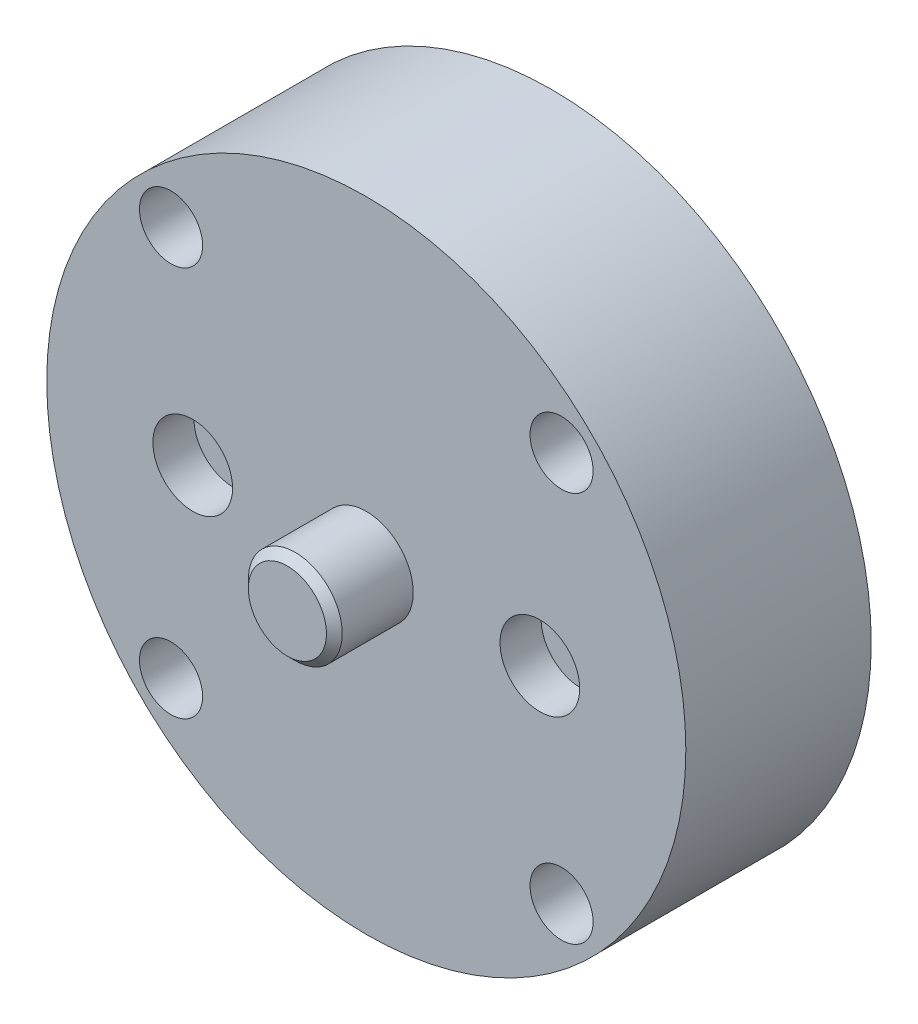
ISO-10303-21;
HEADER;
FILE_DESCRIPTION(('STEP AP214'),'2;1');
FILE_NAME('part.step','',(''),(''),'','','');
FILE_SCHEMA(('AUTOMOTIVE_DESIGN { 1 0 10303 214 1 1 1 1 }'));
ENDSEC;
DATA;
#1=APPLICATION_CONTEXT('core data for automotive mechanical design processes');
#2=APPLICATION_PROTOCOL_DEFINITION('international standard','automotive_design',2000,#1);
#3=PRODUCT_CONTEXT('',#1,'mechanical');
#4=PRODUCT('Part','Part','',(#3));
#5=PRODUCT_RELATED_PRODUCT_CATEGORY('part','',(#4));
#6=PRODUCT_DEFINITION_FORMATION('','',#4);
#7=PRODUCT_DEFINITION_CONTEXT('part definition',#1,'design');
#8=PRODUCT_DEFINITION('design','',#6,#7);
#9=PRODUCT_DEFINITION_SHAPE('','',#8);
#10=(LENGTH_UNIT() NAMED_UNIT(*) SI_UNIT(.MILLI.,.METRE.));
#11=(NAMED_UNIT(*) PLANE_ANGLE_UNIT() SI_UNIT($,.RADIAN.));
#12=(NAMED_UNIT(*) SI_UNIT($,.STERADIAN.) SOLID_ANGLE_UNIT());
#13=UNCERTAINTY_MEASURE_WITH_UNIT(LENGTH_MEASURE(1.E-05),#10,'distance_accuracy_value','');
#14=(GEOMETRIC_REPRESENTATION_CONTEXT(3) GLOBAL_UNCERTAINTY_ASSIGNED_CONTEXT((#13)) GLOBAL_UNIT_ASSIGNED_CONTEXT((#10,
#11,#12)) REPRESENTATION_CONTEXT('',''));
#15=CARTESIAN_POINT('',(0.,0.,0.));
#16=DIRECTION('',(0.,0.,1.));
#17=DIRECTION('',(1.,0.,0.));
#18=AXIS2_PLACEMENT_3D('',#15,#16,#17);
#19=CARTESIAN_POINT('',(0.,0.,23.5));
#20=DIRECTION('',(0.,0.,-1.));
#21=DIRECTION('',(-1.,0.,0.));
#22=AXIS2_PLACEMENT_3D('',#19,#20,#21);
#23=CYLINDRICAL_SURFACE('',#22,40.5);
#24=CARTESIAN_POINT('',(0.,0.,23.5));
#25=DIRECTION('',(0.,0.,-1.));
#26=DIRECTION('',(-1.,0.,0.));
#27=AXIS2_PLACEMENT_3D('',#24,#25,#26);
#28=CIRCLE('',#27,40.5);
#29=CARTESIAN_POINT('',(-40.5,0.,23.5));
#30=VERTEX_POINT('',#29);
#31=EDGE_CURVE('E60',#30,#30,#28,.T.);
#32=ORIENTED_EDGE('',*,*,#31,.T.);
#33=EDGE_LOOP('',(#32));
#34=FACE_BOUND('',#33,.T.);
#35=CARTESIAN_POINT('',(0.,0.,0.));
#36=DIRECTION('',(0.,0.,-1.));
#37=DIRECTION('',(-1.,0.,0.));
#38=AXIS2_PLACEMENT_3D('',#35,#36,#37);
#39=CIRCLE('',#38,40.5);
#40=CARTESIAN_POINT('',(-40.5,0.,0.));
#41=VERTEX_POINT('',#40);
#42=EDGE_CURVE('E62',#41,#41,#39,.T.);
#43=ORIENTED_EDGE('',*,*,#42,.F.);
#44=EDGE_LOOP('',(#43));
#45=FACE_BOUND('',#44,.T.);
#46=ADVANCED_FACE('F41',(#34,#45),#23,.T.);
#47=CARTESIAN_POINT('',(40.5,0.,23.5));
#48=DIRECTION('',(0.,0.,1.));
#49=DIRECTION('',(1.,0.,0.));
#50=AXIS2_PLACEMENT_3D('',#47,#48,#49);
#51=PLANE('',#50);
#52=CARTESIAN_POINT('',(24.748737341529,24.748737341529,23.5));
#53=DIRECTION('',(0.,0.,1.));
#54=DIRECTION('',(1.,0.,0.));
#55=AXIS2_PLACEMENT_3D('',#52,#53,#54);
#56=CIRCLE('',#55,3.99999999999999);
#57=CARTESIAN_POINT('',(28.748737341529,24.748737341529,23.5));
#58=VERTEX_POINT('',#57);
#59=EDGE_CURVE('E125',#58,#58,#56,.T.);
#60=ORIENTED_EDGE('',*,*,#59,.F.);
#61=EDGE_LOOP('',(#60));
#62=FACE_BOUND('',#61,.T.);
#63=CARTESIAN_POINT('',(-24.74873734152,24.748737341529,23.5));
#64=DIRECTION('',(0.,0.,1.));
#65=DIRECTION('',(1.,0.,0.));
#66=AXIS2_PLACEMENT_3D('',#63,#64,#65);
#67=CIRCLE('',#66,3.99999999999999);
#68=CARTESIAN_POINT('',(-20.74873734152,24.748737341529,23.5));
#69=VERTEX_POINT('',#68);
#70=EDGE_CURVE('E109',#69,#69,#67,.T.);
#71=ORIENTED_EDGE('',*,*,#70,.F.);
#72=EDGE_LOOP('',(#71));
#73=FACE_BOUND('',#72,.T.);
#74=CARTESIAN_POINT('',(24.748737341529,-24.74873734152,23.5));
#75=DIRECTION('',(0.,0.,1.));
#76=DIRECTION('',(1.,0.,0.));
#77=AXIS2_PLACEMENT_3D('',#74,#75,#76);
#78=CIRCLE('',#77,3.99999999999999);
#79=CARTESIAN_POINT('',(28.748737341529,-24.74873734152,23.5));
#80=VERTEX_POINT('',#79);
#81=EDGE_CURVE('E96',#80,#80,#78,.T.);
#82=ORIENTED_EDGE('',*,*,#81,.F.);
#83=EDGE_LOOP('',(#82));
#84=FACE_BOUND('',#83,.T.);
#85=CARTESIAN_POINT('',(-24.74873734152,-24.74873734152,23.5));
#86=DIRECTION('',(0.,0.,1.));
#87=DIRECTION('',(1.,0.,0.));
#88=AXIS2_PLACEMENT_3D('',#85,#86,#87);
#89=CIRCLE('',#88,3.99999999999999);
#90=CARTESIAN_POINT('',(-20.74873734152,-24.74873734152,23.5));
#91=VERTEX_POINT('',#90);
#92=EDGE_CURVE('E87',#91,#91,#89,.T.);
#93=ORIENTED_EDGE('',*,*,#92,.F.);
#94=EDGE_LOOP('',(#93));
#95=FACE_BOUND('',#94,.T.);
#96=CARTESIAN_POINT('',(22.,0.,23.5));
#97=DIRECTION('',(0.,0.,1.));
#98=DIRECTION('',(1.,0.,0.));
#99=AXIS2_PLACEMENT_3D('',#96,#97,#98);
#100=CIRCLE('',#99,5.05000000000001);
#101=CARTESIAN_POINT('',(27.05,0.,23.5));
#102=VERTEX_POINT('',#101);
#103=EDGE_CURVE('E72',#102,#102,#100,.T.);
#104=ORIENTED_EDGE('',*,*,#103,.F.);
#105=EDGE_LOOP('',(#104));
#106=FACE_BOUND('',#105,.T.);
#107=CARTESIAN_POINT('',(-22.,0.,23.5));
#108=DIRECTION('',(0.,0.,1.));
#109=DIRECTION('',(1.,0.,0.));
#110=AXIS2_PLACEMENT_3D('',#107,#108,#109);
#111=CIRCLE('',#110,5.05000000000001);
#112=CARTESIAN_POINT('',(-16.95,0.,23.5));
#113=VERTEX_POINT('',#112);
#114=EDGE_CURVE('E68',#113,#113,#111,.T.);
#115=ORIENTED_EDGE('',*,*,#114,.F.);
#116=EDGE_LOOP('',(#115));
#117=FACE_BOUND('',#116,.T.);
#118=CARTESIAN_POINT('',(0.,0.,23.5));
#119=DIRECTION('',(0.,0.,1.));
#120=DIRECTION('',(1.,0.,0.));
#121=AXIS2_PLACEMENT_3D('',#118,#119,#120);
#122=CIRCLE('',#121,5.95);
#123=CARTESIAN_POINT('',(5.95,0.,23.5));
#124=VERTEX_POINT('',#123);
#125=EDGE_CURVE('E52',#124,#124,#122,.T.);
#126=ORIENTED_EDGE('',*,*,#125,.F.);
#127=EDGE_LOOP('',(#126));
#128=FACE_BOUND('',#127,.T.);
#129=ORIENTED_EDGE('',*,*,#31,.F.);
#130=EDGE_LOOP('',(#129));
#131=FACE_BOUND('',#130,.T.);
#132=ADVANCED_FACE('F129',(#62,#73,#84,#95,#106,#117,#128,#131),#51,.T.);
#133=CARTESIAN_POINT('',(0.,0.,0.));
#134=DIRECTION('',(0.,0.,-1.));
#135=DIRECTION('',(-1.,0.,0.));
#136=AXIS2_PLACEMENT_3D('',#133,#134,#135);
#137=PLANE('',#136);
#138=CARTESIAN_POINT('',(24.748737341529,24.748737341529,0.));
#139=DIRECTION('',(0.,0.,1.));
#140=DIRECTION('',(1.,0.,0.));
#141=AXIS2_PLACEMENT_3D('',#138,#139,#140);
#142=CIRCLE('',#141,2.25);
#143=CARTESIAN_POINT('',(26.998737341529,24.748737341529,0.));
#144=VERTEX_POINT('',#143);
#145=EDGE_CURVE('E113',#144,#144,#142,.T.);
#146=ORIENTED_EDGE('',*,*,#145,.T.);
#147=EDGE_LOOP('',(#146));
#148=FACE_BOUND('',#147,.T.);
#149=CARTESIAN_POINT('',(-24.74873734152,24.748737341529,0.));
#150=DIRECTION('',(0.,0.,1.));
#151=DIRECTION('',(1.,0.,0.));
#152=AXIS2_PLACEMENT_3D('',#149,#150,#151);
#153=CIRCLE('',#152,2.25);
#154=CARTESIAN_POINT('',(-22.49873734152,24.748737341529,0.));
#155=VERTEX_POINT('',#154);
#156=EDGE_CURVE('E103',#155,#155,#153,.T.);
#157=ORIENTED_EDGE('',*,*,#156,.T.);
#158=EDGE_LOOP('',(#157));
#159=FACE_BOUND('',#158,.T.);
#160=CARTESIAN_POINT('',(24.748737341529,-24.74873734152,0.));
#161=DIRECTION('',(0.,0.,1.));
#162=DIRECTION('',(1.,0.,0.));
#163=AXIS2_PLACEMENT_3D('',#160,#161,#162);
#164=CIRCLE('',#163,2.25);
#165=CARTESIAN_POINT('',(26.998737341529,-24.74873734152,0.));
#166=VERTEX_POINT('',#165);
#167=EDGE_CURVE('E89',#166,#166,#164,.T.);
#168=ORIENTED_EDGE('',*,*,#167,.T.);
#169=EDGE_LOOP('',(#168));
#170=FACE_BOUND('',#169,.T.);
#171=CARTESIAN_POINT('',(-24.74873734152,-24.74873734152,0.));
#172=DIRECTION('',(0.,0.,1.));
#173=DIRECTION('',(1.,0.,0.));
#174=AXIS2_PLACEMENT_3D('',#171,#172,#173);
#175=CIRCLE('',#174,2.25);
#176=CARTESIAN_POINT('',(-22.49873734152,-24.74873734152,0.));
#177=VERTEX_POINT('',#176);
#178=EDGE_CURVE('E80',#177,#177,#175,.T.);
#179=ORIENTED_EDGE('',*,*,#178,.T.);
#180=EDGE_LOOP('',(#179));
#181=FACE_BOUND('',#180,.T.);
#182=ORIENTED_EDGE('',*,*,#42,.T.);
#183=EDGE_LOOP('',(#182));
#184=FACE_BOUND('',#183,.T.);
#185=ADVANCED_FACE('F132',(#148,#159,#170,#181,#184),#137,.T.);
#186=CARTESIAN_POINT('',(0.,0.,33.5));
#187=DIRECTION('',(0.,0.,-1.));
#188=DIRECTION('',(-1.,0.,0.));
#189=AXIS2_PLACEMENT_3D('',#186,#187,#188);
#190=CYLINDRICAL_SURFACE('',#189,5.95);
#191=CARTESIAN_POINT('',(0.,0.,32.5000000000004));
#192=DIRECTION('',(0.,0.,1.));
#193=DIRECTION('',(1.,0.,0.));
#194=AXIS2_PLACEMENT_3D('',#191,#192,#193);
#195=CIRCLE('',#194,5.95);
#196=CARTESIAN_POINT('',(5.95,0.,32.5000000000004));
#197=VERTEX_POINT('',#196);
#198=EDGE_CURVE('E10',#197,#197,#195,.F.);
#199=ORIENTED_EDGE('',*,*,#198,.T.);
#200=EDGE_LOOP('',(#199));
#201=FACE_BOUND('',#200,.T.);
#202=ORIENTED_EDGE('',*,*,#125,.T.);
#203=EDGE_LOOP('',(#202));
#204=FACE_BOUND('',#203,.T.);
#205=ADVANCED_FACE('F155',(#201,#204),#190,.T.);
#206=CARTESIAN_POINT('',(0.,0.,33.5));
#207=DIRECTION('',(0.,0.,1.));
#208=DIRECTION('',(1.,0.,0.));
#209=AXIS2_PLACEMENT_3D('',#206,#207,#208);
#210=PLANE('',#209);
#211=CARTESIAN_POINT('',(0.,0.,33.5));
#212=DIRECTION('',(0.,0.,1.));
#213=DIRECTION('',(1.,0.,0.));
#214=AXIS2_PLACEMENT_3D('',#211,#212,#213);
#215=CIRCLE('',#214,4.94999999999954);
#216=CARTESIAN_POINT('',(4.94999999999954,0.,33.5));
#217=VERTEX_POINT('',#216);
#218=EDGE_CURVE('E47',#217,#217,#215,.T.);
#219=ORIENTED_EDGE('',*,*,#218,.T.);
#220=EDGE_LOOP('',(#219));
#221=FACE_BOUND('',#220,.T.);
#222=ADVANCED_FACE('F157',(#221),#210,.T.);
#223=CARTESIAN_POINT('',(-22.,0.,18.3));
#224=DIRECTION('',(0.,0.,-1.));
#225=DIRECTION('',(-1.,0.,0.));
#226=AXIS2_PLACEMENT_3D('',#223,#224,#225);
#227=PLANE('',#226);
#228=CARTESIAN_POINT('',(-22.,0.,18.3));
#229=DIRECTION('',(0.,0.,1.));
#230=DIRECTION('',(1.,0.,0.));
#231=AXIS2_PLACEMENT_3D('',#228,#229,#230);
#232=CIRCLE('',#231,5.05000000000001);
#233=CARTESIAN_POINT('',(-16.95,0.,18.3));
#234=VERTEX_POINT('',#233);
#235=EDGE_CURVE('E63',#234,#234,#232,.T.);
#236=ORIENTED_EDGE('',*,*,#235,.T.);
#237=EDGE_LOOP('',(#236));
#238=FACE_BOUND('',#237,.T.);
#239=ADVANCED_FACE('F164',(#238),#227,.F.);
#240=CARTESIAN_POINT('',(-22.,0.,23.5));
#241=DIRECTION('',(0.,0.,1.));
#242=DIRECTION('',(1.,0.,0.));
#243=AXIS2_PLACEMENT_3D('',#240,#241,#242);
#244=CYLINDRICAL_SURFACE('',#243,5.05000000000001);
#245=ORIENTED_EDGE('',*,*,#235,.F.);
#246=EDGE_LOOP('',(#245));
#247=FACE_BOUND('',#246,.T.);
#248=ORIENTED_EDGE('',*,*,#114,.T.);
#249=EDGE_LOOP('',(#248));
#250=FACE_BOUND('',#249,.T.);
#251=ADVANCED_FACE('F166',(#247,#250),#244,.F.);
#252=CARTESIAN_POINT('',(22.,0.,18.3));
#253=DIRECTION('',(0.,0.,-1.));
#254=DIRECTION('',(-1.,0.,0.));
#255=AXIS2_PLACEMENT_3D('',#252,#253,#254);
#256=PLANE('',#255);
#257=CARTESIAN_POINT('',(22.,0.,18.3));
#258=DIRECTION('',(0.,0.,1.));
#259=DIRECTION('',(1.,0.,0.));
#260=AXIS2_PLACEMENT_3D('',#257,#258,#259);
#261=CIRCLE('',#260,5.05000000000001);
#262=CARTESIAN_POINT('',(27.05,0.,18.3));
#263=VERTEX_POINT('',#262);
#264=EDGE_CURVE('E71',#263,#263,#261,.T.);
#265=ORIENTED_EDGE('',*,*,#264,.T.);
#266=EDGE_LOOP('',(#265));
#267=FACE_BOUND('',#266,.T.);
#268=ADVANCED_FACE('F175',(#267),#256,.F.);
#269=CARTESIAN_POINT('',(22.,0.,23.5));
#270=DIRECTION('',(0.,0.,1.));
#271=DIRECTION('',(1.,0.,0.));
#272=AXIS2_PLACEMENT_3D('',#269,#270,#271);
#273=CYLINDRICAL_SURFACE('',#272,5.05000000000001);
#274=ORIENTED_EDGE('',*,*,#264,.F.);
#275=EDGE_LOOP('',(#274));
#276=FACE_BOUND('',#275,.T.);
#277=ORIENTED_EDGE('',*,*,#103,.T.);
#278=EDGE_LOOP('',(#277));
#279=FACE_BOUND('',#278,.T.);
#280=ADVANCED_FACE('F176',(#276,#279),#273,.F.);
#281=CARTESIAN_POINT('',(-24.74873734152,-24.74873734152,23.5));
#282=DIRECTION('',(0.,0.,1.));
#283=DIRECTION('',(1.,0.,0.));
#284=AXIS2_PLACEMENT_3D('',#281,#282,#283);
#285=CYLINDRICAL_SURFACE('',#284,2.25000000000001);
#286=ORIENTED_EDGE('',*,*,#178,.F.);
#287=EDGE_LOOP('',(#286));
#288=FACE_BOUND('',#287,.T.);
#289=CARTESIAN_POINT('',(-24.74873734152,-24.74873734152,17.5));
#290=DIRECTION('',(0.,0.,1.));
#291=DIRECTION('',(1.,0.,0.));
#292=AXIS2_PLACEMENT_3D('',#289,#290,#291);
#293=CIRCLE('',#292,2.25000000000001);
#294=CARTESIAN_POINT('',(-22.49873734152,-24.74873734152,17.5));
#295=VERTEX_POINT('',#294);
#296=EDGE_CURVE('E78',#295,#295,#293,.T.);
#297=ORIENTED_EDGE('',*,*,#296,.T.);
#298=EDGE_LOOP('',(#297));
#299=FACE_BOUND('',#298,.T.);
#300=ADVANCED_FACE('F179',(#288,#299),#285,.F.);
#301=CARTESIAN_POINT('',(-22.49873734152,-24.74873734152,17.5));
#302=DIRECTION('',(0.,0.,-1.));
#303=DIRECTION('',(-1.,0.,0.));
#304=AXIS2_PLACEMENT_3D('',#301,#302,#303);
#305=PLANE('',#304);
#306=ORIENTED_EDGE('',*,*,#296,.F.);
#307=EDGE_LOOP('',(#306));
#308=FACE_BOUND('',#307,.T.);
#309=CARTESIAN_POINT('',(-24.74873734152,-24.74873734152,17.5));
#310=DIRECTION('',(0.,0.,1.));
#311=DIRECTION('',(1.,0.,0.));
#312=AXIS2_PLACEMENT_3D('',#309,#310,#311);
#313=CIRCLE('',#312,3.99999999999999);
#314=CARTESIAN_POINT('',(-20.74873734152,-24.74873734152,17.5));
#315=VERTEX_POINT('',#314);
#316=EDGE_CURVE('E84',#315,#315,#313,.T.);
#317=ORIENTED_EDGE('',*,*,#316,.T.);
#318=EDGE_LOOP('',(#317));
#319=FACE_BOUND('',#318,.T.);
#320=ADVANCED_FACE('F182',(#308,#319),#305,.F.);
#321=CARTESIAN_POINT('',(-24.74873734152,-24.74873734152,23.5));
#322=DIRECTION('',(0.,0.,1.));
#323=DIRECTION('',(1.,0.,0.));
#324=AXIS2_PLACEMENT_3D('',#321,#322,#323);
#325=CYLINDRICAL_SURFACE('',#324,3.99999999999999);
#326=ORIENTED_EDGE('',*,*,#316,.F.);
#327=EDGE_LOOP('',(#326));
#328=FACE_BOUND('',#327,.T.);
#329=ORIENTED_EDGE('',*,*,#92,.T.);
#330=EDGE_LOOP('',(#329));
#331=FACE_BOUND('',#330,.T.);
#332=ADVANCED_FACE('F190',(#328,#331),#325,.F.);
#333=CARTESIAN_POINT('',(24.748737341529,-24.74873734152,23.5));
#334=DIRECTION('',(0.,0.,1.));
#335=DIRECTION('',(1.,0.,0.));
#336=AXIS2_PLACEMENT_3D('',#333,#334,#335);
#337=CYLINDRICAL_SURFACE('',#336,2.25000000000001);
#338=ORIENTED_EDGE('',*,*,#167,.F.);
#339=EDGE_LOOP('',(#338));
#340=FACE_BOUND('',#339,.T.);
#341=CARTESIAN_POINT('',(24.748737341529,-24.74873734152,17.5));
#342=DIRECTION('',(0.,0.,1.));
#343=DIRECTION('',(1.,0.,0.));
#344=AXIS2_PLACEMENT_3D('',#341,#342,#343);
#345=CIRCLE('',#344,2.25000000000001);
#346=CARTESIAN_POINT('',(26.998737341529,-24.74873734152,17.5));
#347=VERTEX_POINT('',#346);
#348=EDGE_CURVE('E95',#347,#347,#345,.T.);
#349=ORIENTED_EDGE('',*,*,#348,.T.);
#350=EDGE_LOOP('',(#349));
#351=FACE_BOUND('',#350,.T.);
#352=ADVANCED_FACE('F191',(#340,#351),#337,.F.);
#353=CARTESIAN_POINT('',(26.998737341529,-24.74873734152,17.5));
#354=DIRECTION('',(0.,0.,-1.));
#355=DIRECTION('',(-1.,0.,0.));
#356=AXIS2_PLACEMENT_3D('',#353,#354,#355);
#357=PLANE('',#356);
#358=ORIENTED_EDGE('',*,*,#348,.F.);
#359=EDGE_LOOP('',(#358));
#360=FACE_BOUND('',#359,.T.);
#361=CARTESIAN_POINT('',(24.748737341529,-24.74873734152,17.5));
#362=DIRECTION('',(0.,0.,1.));
#363=DIRECTION('',(1.,0.,0.));
#364=AXIS2_PLACEMENT_3D('',#361,#362,#363);
#365=CIRCLE('',#364,3.99999999999999);
#366=CARTESIAN_POINT('',(28.748737341529,-24.74873734152,17.5));
#367=VERTEX_POINT('',#366);
#368=EDGE_CURVE('E94',#367,#367,#365,.T.);
#369=ORIENTED_EDGE('',*,*,#368,.T.);
#370=EDGE_LOOP('',(#369));
#371=FACE_BOUND('',#370,.T.);
#372=ADVANCED_FACE('F195',(#360,#371),#357,.F.);
#373=CARTESIAN_POINT('',(24.748737341529,-24.74873734152,23.5));
#374=DIRECTION('',(0.,0.,1.));
#375=DIRECTION('',(1.,0.,0.));
#376=AXIS2_PLACEMENT_3D('',#373,#374,#375);
#377=CYLINDRICAL_SURFACE('',#376,3.99999999999999);
#378=ORIENTED_EDGE('',*,*,#368,.F.);
#379=EDGE_LOOP('',(#378));
#380=FACE_BOUND('',#379,.T.);
#381=ORIENTED_EDGE('',*,*,#81,.T.);
#382=EDGE_LOOP('',(#381));
#383=FACE_BOUND('',#382,.T.);
#384=ADVANCED_FACE('F199',(#380,#383),#377,.F.);
#385=CARTESIAN_POINT('',(-24.74873734152,24.748737341529,23.5));
#386=DIRECTION('',(0.,0.,1.));
#387=DIRECTION('',(1.,0.,0.));
#388=AXIS2_PLACEMENT_3D('',#385,#386,#387);
#389=CYLINDRICAL_SURFACE('',#388,2.25000000000001);
#390=ORIENTED_EDGE('',*,*,#156,.F.);
#391=EDGE_LOOP('',(#390));
#392=FACE_BOUND('',#391,.T.);
#393=CARTESIAN_POINT('',(-24.74873734152,24.748737341529,17.5));
#394=DIRECTION('',(0.,0.,1.));
#395=DIRECTION('',(1.,0.,0.));
#396=AXIS2_PLACEMENT_3D('',#393,#394,#395);
#397=CIRCLE('',#396,2.25000000000001);
#398=CARTESIAN_POINT('',(-22.49873734152,24.748737341529,17.5));
#399=VERTEX_POINT('',#398);
#400=EDGE_CURVE('E104',#399,#399,#397,.T.);
#401=ORIENTED_EDGE('',*,*,#400,.T.);
#402=EDGE_LOOP('',(#401));
#403=FACE_BOUND('',#402,.T.);
#404=ADVANCED_FACE('F203',(#392,#403),#389,.F.);
#405=CARTESIAN_POINT('',(-22.49873734152,24.748737341529,17.5));
#406=DIRECTION('',(0.,0.,-1.));
#407=DIRECTION('',(-1.,0.,0.));
#408=AXIS2_PLACEMENT_3D('',#405,#406,#407);
#409=PLANE('',#408);
#410=ORIENTED_EDGE('',*,*,#400,.F.);
#411=EDGE_LOOP('',(#410));
#412=FACE_BOUND('',#411,.T.);
#413=CARTESIAN_POINT('',(-24.74873734152,24.748737341529,17.5));
#414=DIRECTION('',(0.,0.,1.));
#415=DIRECTION('',(1.,0.,0.));
#416=AXIS2_PLACEMENT_3D('',#413,#414,#415);
#417=CIRCLE('',#416,3.99999999999999);
#418=CARTESIAN_POINT('',(-20.74873734152,24.748737341529,17.5));
#419=VERTEX_POINT('',#418);
#420=EDGE_CURVE('E110',#419,#419,#417,.T.);
#421=ORIENTED_EDGE('',*,*,#420,.T.);
#422=EDGE_LOOP('',(#421));
#423=FACE_BOUND('',#422,.T.);
#424=ADVANCED_FACE('F210',(#412,#423),#409,.F.);
#425=CARTESIAN_POINT('',(-24.74873734152,24.748737341529,23.5));
#426=DIRECTION('',(0.,0.,1.));
#427=DIRECTION('',(1.,0.,0.));
#428=AXIS2_PLACEMENT_3D('',#425,#426,#427);
#429=CYLINDRICAL_SURFACE('',#428,3.99999999999999);
#430=ORIENTED_EDGE('',*,*,#420,.F.);
#431=EDGE_LOOP('',(#430));
#432=FACE_BOUND('',#431,.T.);
#433=ORIENTED_EDGE('',*,*,#70,.T.);
#434=EDGE_LOOP('',(#433));
#435=FACE_BOUND('',#434,.T.);
#436=ADVANCED_FACE('F211',(#432,#435),#429,.F.);
#437=CARTESIAN_POINT('',(24.748737341529,24.748737341529,23.5));
#438=DIRECTION('',(0.,0.,1.));
#439=DIRECTION('',(1.,0.,0.));
#440=AXIS2_PLACEMENT_3D('',#437,#438,#439);
#441=CYLINDRICAL_SURFACE('',#440,2.25000000000001);
#442=ORIENTED_EDGE('',*,*,#145,.F.);
#443=EDGE_LOOP('',(#442));
#444=FACE_BOUND('',#443,.T.);
#445=CARTESIAN_POINT('',(24.748737341529,24.748737341529,17.5));
#446=DIRECTION('',(0.,0.,1.));
#447=DIRECTION('',(1.,0.,0.));
#448=AXIS2_PLACEMENT_3D('',#445,#446,#447);
#449=CIRCLE('',#448,2.25000000000001);
#450=CARTESIAN_POINT('',(26.998737341529,24.748737341529,17.5));
#451=VERTEX_POINT('',#450);
#452=EDGE_CURVE('E116',#451,#451,#449,.T.);
#453=ORIENTED_EDGE('',*,*,#452,.T.);
#454=EDGE_LOOP('',(#453));
#455=FACE_BOUND('',#454,.T.);
#456=ADVANCED_FACE('F215',(#444,#455),#441,.F.);
#457=CARTESIAN_POINT('',(26.998737341529,24.748737341529,17.5));
#458=DIRECTION('',(0.,0.,-1.));
#459=DIRECTION('',(-1.,0.,0.));
#460=AXIS2_PLACEMENT_3D('',#457,#458,#459);
#461=PLANE('',#460);
#462=ORIENTED_EDGE('',*,*,#452,.F.);
#463=EDGE_LOOP('',(#462));
#464=FACE_BOUND('',#463,.T.);
#465=CARTESIAN_POINT('',(24.748737341529,24.748737341529,17.5));
#466=DIRECTION('',(0.,0.,1.));
#467=DIRECTION('',(1.,0.,0.));
#468=AXIS2_PLACEMENT_3D('',#465,#466,#467);
#469=CIRCLE('',#468,3.99999999999999);
#470=CARTESIAN_POINT('',(28.748737341529,24.748737341529,17.5));
#471=VERTEX_POINT('',#470);
#472=EDGE_CURVE('E118',#471,#471,#469,.T.);
#473=ORIENTED_EDGE('',*,*,#472,.T.);
#474=EDGE_LOOP('',(#473));
#475=FACE_BOUND('',#474,.T.);
#476=ADVANCED_FACE('F219',(#464,#475),#461,.F.);
#477=CARTESIAN_POINT('',(24.748737341529,24.748737341529,23.5));
#478=DIRECTION('',(0.,0.,1.));
#479=DIRECTION('',(1.,0.,0.));
#480=AXIS2_PLACEMENT_3D('',#477,#478,#479);
#481=CYLINDRICAL_SURFACE('',#480,3.99999999999999);
#482=ORIENTED_EDGE('',*,*,#472,.F.);
#483=EDGE_LOOP('',(#482));
#484=FACE_BOUND('',#483,.T.);
#485=ORIENTED_EDGE('',*,*,#59,.T.);
#486=EDGE_LOOP('',(#485));
#487=FACE_BOUND('',#486,.T.);
#488=ADVANCED_FACE('F126',(#484,#487),#481,.F.);
#489=CARTESIAN_POINT('',(0.,0.,33.5));
#490=DIRECTION('',(0.,0.,-1.));
#491=DIRECTION('',(-1.,0.,0.));
#492=AXIS2_PLACEMENT_3D('',#489,#490,#491);
#493=CONICAL_SURFACE('',#492,4.94999999999954,0.785398163397894);
#494=ORIENTED_EDGE('',*,*,#198,.F.);
#495=EDGE_LOOP('',(#494));
#496=FACE_BOUND('',#495,.T.);
#497=ORIENTED_EDGE('',*,*,#218,.F.);
#498=EDGE_LOOP('',(#497));
#499=FACE_BOUND('',#498,.T.);
#500=ADVANCED_FACE('F42',(#496,#499),#493,.T.);
#501=CLOSED_SHELL('',(#46,#132,#185,#205,#222,#239,#251,#268,#280,#300,#320,#332,#352,#372,#384,
#404,#424,#436,#456,#476,#488,#500));
#502=MANIFOLD_SOLID_BREP('B2',#501);
#503=ADVANCED_BREP_SHAPE_REPRESENTATION('',(#18,#502),#14);
#504=SHAPE_DEFINITION_REPRESENTATION(#9,#503);
ENDSEC;
END-ISO-10303-21;
